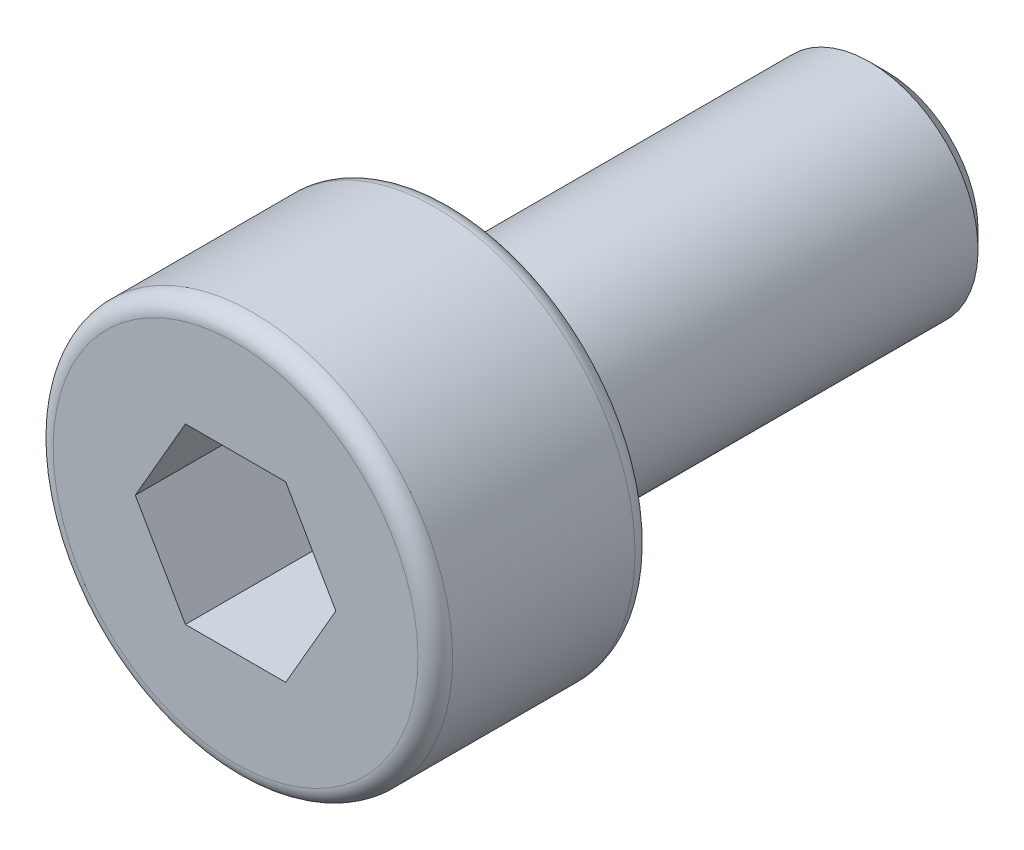
ISO-10303-21;
HEADER;
FILE_DESCRIPTION(('STEP AP214'),'2;1');
FILE_NAME('part.step','',(''),(''),'','','');
FILE_SCHEMA(('AUTOMOTIVE_DESIGN { 1 0 10303 214 1 1 1 1 }'));
ENDSEC;
DATA;
#1=APPLICATION_CONTEXT('core data for automotive mechanical design processes');
#2=APPLICATION_PROTOCOL_DEFINITION('international standard','automotive_design',2000,#1);
#3=PRODUCT_CONTEXT('',#1,'mechanical');
#4=PRODUCT('Part','Part','',(#3));
#5=PRODUCT_RELATED_PRODUCT_CATEGORY('part','',(#4));
#6=PRODUCT_DEFINITION_FORMATION('','',#4);
#7=PRODUCT_DEFINITION_CONTEXT('part definition',#1,'design');
#8=PRODUCT_DEFINITION('design','',#6,#7);
#9=PRODUCT_DEFINITION_SHAPE('','',#8);
#10=(LENGTH_UNIT() NAMED_UNIT(*) SI_UNIT(.MILLI.,.METRE.));
#11=(NAMED_UNIT(*) PLANE_ANGLE_UNIT() SI_UNIT($,.RADIAN.));
#12=(NAMED_UNIT(*) SI_UNIT($,.STERADIAN.) SOLID_ANGLE_UNIT());
#13=UNCERTAINTY_MEASURE_WITH_UNIT(LENGTH_MEASURE(1.E-05),#10,'distance_accuracy_value','');
#14=(GEOMETRIC_REPRESENTATION_CONTEXT(3) GLOBAL_UNCERTAINTY_ASSIGNED_CONTEXT((#13)) GLOBAL_UNIT_ASSIGNED_CONTEXT((#10,
#11,#12)) REPRESENTATION_CONTEXT('',''));
#15=CARTESIAN_POINT('',(0.,0.,0.));
#16=DIRECTION('',(0.,0.,1.));
#17=DIRECTION('',(1.,0.,0.));
#18=AXIS2_PLACEMENT_3D('',#15,#16,#17);
#19=CARTESIAN_POINT('',(0.,0.,0.));
#20=DIRECTION('',(0.,0.,1.));
#21=DIRECTION('',(0.,-1.,0.));
#22=AXIS2_PLACEMENT_3D('',#19,#20,#21);
#23=PLANE('',#22);
#24=DIRECTION('',(0.5,0.866025403784439,0.));
#25=VECTOR('',#24,1.);
#26=CARTESIAN_POINT('',(0.577350269189626,-1.,0.));
#27=LINE('',#26,#25);
#28=CARTESIAN_POINT('',(0.577350269189626,-1.,0.));
#29=VERTEX_POINT('',#28);
#30=CARTESIAN_POINT('',(1.15470053837925,0.,0.));
#31=VERTEX_POINT('',#30);
#32=EDGE_CURVE('E51',#29,#31,#27,.T.);
#33=ORIENTED_EDGE('',*,*,#32,.F.);
#34=DIRECTION('',(1.,0.,0.));
#35=VECTOR('',#34,1.);
#36=CARTESIAN_POINT('',(-0.577350269189626,-1.,0.));
#37=LINE('',#36,#35);
#38=CARTESIAN_POINT('',(-0.577350269189626,-1.,0.));
#39=VERTEX_POINT('',#38);
#40=EDGE_CURVE('E134',#39,#29,#37,.T.);
#41=ORIENTED_EDGE('',*,*,#40,.F.);
#42=DIRECTION('',(0.5,-0.866025403784438,0.));
#43=VECTOR('',#42,1.);
#44=CARTESIAN_POINT('',(-1.15470053837925,0.,0.));
#45=LINE('',#44,#43);
#46=CARTESIAN_POINT('',(-1.15470053837925,0.,0.));
#47=VERTEX_POINT('',#46);
#48=EDGE_CURVE('E132',#47,#39,#45,.T.);
#49=ORIENTED_EDGE('',*,*,#48,.F.);
#50=DIRECTION('',(-0.5,-0.866025403784439,0.));
#51=VECTOR('',#50,1.);
#52=CARTESIAN_POINT('',(-0.577350269189626,1.,0.));
#53=LINE('',#52,#51);
#54=CARTESIAN_POINT('',(-0.577350269189626,1.,0.));
#55=VERTEX_POINT('',#54);
#56=EDGE_CURVE('E99',#55,#47,#53,.T.);
#57=ORIENTED_EDGE('',*,*,#56,.F.);
#58=DIRECTION('',(-1.,0.,0.));
#59=VECTOR('',#58,1.);
#60=CARTESIAN_POINT('',(0.577350269189625,1.,0.));
#61=LINE('',#60,#59);
#62=CARTESIAN_POINT('',(0.577350269189625,1.,0.));
#63=VERTEX_POINT('',#62);
#64=EDGE_CURVE('E128',#63,#55,#61,.T.);
#65=ORIENTED_EDGE('',*,*,#64,.F.);
#66=DIRECTION('',(-0.5,0.866025403784438,0.));
#67=VECTOR('',#66,1.);
#68=CARTESIAN_POINT('',(1.15470053837925,0.,0.));
#69=LINE('',#68,#67);
#70=EDGE_CURVE('E125',#31,#63,#69,.T.);
#71=ORIENTED_EDGE('',*,*,#70,.F.);
#72=EDGE_LOOP('',(#33,#41,#49,#57,#65,#71));
#73=FACE_BOUND('',#72,.T.);
#74=CARTESIAN_POINT('',(0.,0.,0.));
#75=DIRECTION('',(0.,0.,1.));
#76=DIRECTION('',(0.,-1.,0.));
#77=AXIS2_PLACEMENT_3D('',#74,#75,#76);
#78=CIRCLE('',#77,2.1);
#79=CARTESIAN_POINT('',(0.,-2.1,0.));
#80=VERTEX_POINT('',#79);
#81=EDGE_CURVE('E155',#80,#80,#78,.T.);
#82=ORIENTED_EDGE('',*,*,#81,.T.);
#83=EDGE_LOOP('',(#82));
#84=FACE_BOUND('',#83,.T.);
#85=ADVANCED_FACE('F35',(#73,#84),#23,.T.);
#86=CARTESIAN_POINT('',(0.,0.,-7.5));
#87=DIRECTION('',(0.,0.,-1.));
#88=DIRECTION('',(0.,1.,0.));
#89=AXIS2_PLACEMENT_3D('',#86,#87,#88);
#90=CYLINDRICAL_SURFACE('',#89,2.3);
#91=CARTESIAN_POINT('',(0.,0.,-2.3));
#92=DIRECTION('',(0.,0.,-1.));
#93=DIRECTION('',(0.,1.,0.));
#94=AXIS2_PLACEMENT_3D('',#91,#92,#93);
#95=CIRCLE('',#94,2.3);
#96=CARTESIAN_POINT('',(0.,2.3,-2.3));
#97=VERTEX_POINT('',#96);
#98=EDGE_CURVE('E152',#97,#97,#95,.F.);
#99=ORIENTED_EDGE('',*,*,#98,.T.);
#100=EDGE_LOOP('',(#99));
#101=FACE_BOUND('',#100,.T.);
#102=CARTESIAN_POINT('',(0.,0.,-0.2));
#103=DIRECTION('',(0.,0.,1.));
#104=DIRECTION('',(0.,-1.,0.));
#105=AXIS2_PLACEMENT_3D('',#102,#103,#104);
#106=CIRCLE('',#105,2.3);
#107=CARTESIAN_POINT('',(0.,-2.3,-0.2));
#108=VERTEX_POINT('',#107);
#109=EDGE_CURVE('E149',#108,#108,#106,.F.);
#110=ORIENTED_EDGE('',*,*,#109,.T.);
#111=EDGE_LOOP('',(#110));
#112=FACE_BOUND('',#111,.T.);
#113=ADVANCED_FACE('F176',(#101,#112),#90,.T.);
#114=CARTESIAN_POINT('',(0.,2.3,-2.5));
#115=DIRECTION('',(0.,0.,-1.));
#116=DIRECTION('',(0.,1.,0.));
#117=AXIS2_PLACEMENT_3D('',#114,#115,#116);
#118=PLANE('',#117);
#119=CARTESIAN_POINT('',(0.,0.,-2.5));
#120=DIRECTION('',(0.,0.,-1.));
#121=DIRECTION('',(0.,1.,0.));
#122=AXIS2_PLACEMENT_3D('',#119,#120,#121);
#123=CIRCLE('',#122,2.1);
#124=CARTESIAN_POINT('',(0.,2.1,-2.5));
#125=VERTEX_POINT('',#124);
#126=EDGE_CURVE('E146',#125,#125,#123,.T.);
#127=ORIENTED_EDGE('',*,*,#126,.T.);
#128=EDGE_LOOP('',(#127));
#129=FACE_BOUND('',#128,.T.);
#130=CARTESIAN_POINT('',(0.,0.,-2.5));
#131=DIRECTION('',(0.,0.,-1.));
#132=DIRECTION('',(0.,1.,0.));
#133=AXIS2_PLACEMENT_3D('',#130,#131,#132);
#134=CIRCLE('',#133,1.25);
#135=CARTESIAN_POINT('',(0.,1.25,-2.5));
#136=VERTEX_POINT('',#135);
#137=EDGE_CURVE('E138',#136,#136,#134,.T.);
#138=ORIENTED_EDGE('',*,*,#137,.F.);
#139=EDGE_LOOP('',(#138));
#140=FACE_BOUND('',#139,.T.);
#141=ADVANCED_FACE('F182',(#129,#140),#118,.T.);
#142=CARTESIAN_POINT('',(0.,0.,-7.5));
#143=DIRECTION('',(0.,0.,-1.));
#144=DIRECTION('',(0.,1.,0.));
#145=AXIS2_PLACEMENT_3D('',#142,#143,#144);
#146=CYLINDRICAL_SURFACE('',#145,1.25);
#147=CARTESIAN_POINT('',(0.,0.,-7.3));
#148=DIRECTION('',(0.,0.,-1.));
#149=DIRECTION('',(0.,1.,0.));
#150=AXIS2_PLACEMENT_3D('',#147,#148,#149);
#151=CIRCLE('',#150,1.25);
#152=CARTESIAN_POINT('',(0.,1.25,-7.3));
#153=VERTEX_POINT('',#152);
#154=EDGE_CURVE('E11',#153,#153,#151,.F.);
#155=ORIENTED_EDGE('',*,*,#154,.T.);
#156=EDGE_LOOP('',(#155));
#157=FACE_BOUND('',#156,.T.);
#158=ORIENTED_EDGE('',*,*,#137,.T.);
#159=EDGE_LOOP('',(#158));
#160=FACE_BOUND('',#159,.T.);
#161=ADVANCED_FACE('F193',(#157,#160),#146,.T.);
#162=CARTESIAN_POINT('',(0.,1.25,-7.5));
#163=DIRECTION('',(0.,0.,-1.));
#164=DIRECTION('',(0.,1.,0.));
#165=AXIS2_PLACEMENT_3D('',#162,#163,#164);
#166=PLANE('',#165);
#167=CARTESIAN_POINT('',(0.,0.,-7.5));
#168=DIRECTION('',(0.,0.,-1.));
#169=DIRECTION('',(0.,1.,0.));
#170=AXIS2_PLACEMENT_3D('',#167,#168,#169);
#171=CIRCLE('',#170,1.05);
#172=CARTESIAN_POINT('',(0.,1.05,-7.5));
#173=VERTEX_POINT('',#172);
#174=EDGE_CURVE('E44',#173,#173,#171,.T.);
#175=ORIENTED_EDGE('',*,*,#174,.T.);
#176=EDGE_LOOP('',(#175));
#177=FACE_BOUND('',#176,.T.);
#178=ADVANCED_FACE('F160',(#177),#166,.T.);
#179=CARTESIAN_POINT('',(0.,0.,-2.3));
#180=DIRECTION('',(0.,0.,-1.));
#181=DIRECTION('',(0.,1.,0.));
#182=AXIS2_PLACEMENT_3D('',#179,#180,#181);
#183=TOROIDAL_SURFACE('',#182,2.1,0.2);
#184=ORIENTED_EDGE('',*,*,#98,.F.);
#185=EDGE_LOOP('',(#184));
#186=FACE_BOUND('',#185,.T.);
#187=ORIENTED_EDGE('',*,*,#126,.F.);
#188=EDGE_LOOP('',(#187));
#189=FACE_BOUND('',#188,.T.);
#190=ADVANCED_FACE('F172',(#186,#189),#183,.T.);
#191=CARTESIAN_POINT('',(0.,0.,-0.2));
#192=DIRECTION('',(0.,0.,1.));
#193=DIRECTION('',(0.,-1.,0.));
#194=AXIS2_PLACEMENT_3D('',#191,#192,#193);
#195=TOROIDAL_SURFACE('',#194,2.1,0.2);
#196=ORIENTED_EDGE('',*,*,#81,.F.);
#197=EDGE_LOOP('',(#196));
#198=FACE_BOUND('',#197,.T.);
#199=ORIENTED_EDGE('',*,*,#109,.F.);
#200=EDGE_LOOP('',(#199));
#201=FACE_BOUND('',#200,.T.);
#202=ADVANCED_FACE('F164',(#198,#201),#195,.T.);
#203=CARTESIAN_POINT('',(0.,0.,-7.5));
#204=DIRECTION('',(0.,0.,1.));
#205=DIRECTION('',(0.,-1.,0.));
#206=AXIS2_PLACEMENT_3D('',#203,#204,#205);
#207=CONICAL_SURFACE('',#206,1.05,0.785398163397441);
#208=ORIENTED_EDGE('',*,*,#154,.F.);
#209=EDGE_LOOP('',(#208));
#210=FACE_BOUND('',#209,.T.);
#211=ORIENTED_EDGE('',*,*,#174,.F.);
#212=EDGE_LOOP('',(#211));
#213=FACE_BOUND('',#212,.T.);
#214=ADVANCED_FACE('F38',(#210,#213),#207,.T.);
#215=CARTESIAN_POINT('',(0.577350269189626,-1.,-1.5));
#216=DIRECTION('',(0.866025403784439,-0.5,0.));
#217=DIRECTION('',(0.5,0.866025403784439,0.));
#218=AXIS2_PLACEMENT_3D('',#215,#216,#217);
#219=PLANE('',#218);
#220=ORIENTED_EDGE('',*,*,#32,.T.);
#221=DIRECTION('',(0.,0.,1.));
#222=VECTOR('',#221,1.);
#223=CARTESIAN_POINT('',(1.15470053837925,0.,-1.5));
#224=LINE('',#223,#222);
#225=CARTESIAN_POINT('',(1.15470053837925,0.,-1.5));
#226=VERTEX_POINT('',#225);
#227=EDGE_CURVE('E81',#226,#31,#224,.T.);
#228=ORIENTED_EDGE('',*,*,#227,.F.);
#229=DIRECTION('',(0.5,0.866025403784439,0.));
#230=VECTOR('',#229,1.);
#231=CARTESIAN_POINT('',(0.577350269189626,-1.,-1.5));
#232=LINE('',#231,#230);
#233=CARTESIAN_POINT('',(0.577350269189626,-1.,-1.5));
#234=VERTEX_POINT('',#233);
#235=EDGE_CURVE('E136',#234,#226,#232,.T.);
#236=ORIENTED_EDGE('',*,*,#235,.F.);
#237=DIRECTION('',(0.,0.,1.));
#238=VECTOR('',#237,1.);
#239=CARTESIAN_POINT('',(0.577350269189626,-1.,-1.5));
#240=LINE('',#239,#238);
#241=EDGE_CURVE('E59',#234,#29,#240,.T.);
#242=ORIENTED_EDGE('',*,*,#241,.T.);
#243=EDGE_LOOP('',(#220,#228,#236,#242));
#244=FACE_BOUND('',#243,.T.);
#245=ADVANCED_FACE('F163',(#244),#219,.F.);
#246=CARTESIAN_POINT('',(-0.577350269189626,-1.,-1.5));
#247=DIRECTION('',(0.,-1.,0.));
#248=DIRECTION('',(0.,0.,-1.));
#249=AXIS2_PLACEMENT_3D('',#246,#247,#248);
#250=PLANE('',#249);
#251=ORIENTED_EDGE('',*,*,#40,.T.);
#252=ORIENTED_EDGE('',*,*,#241,.F.);
#253=DIRECTION('',(1.,0.,0.));
#254=VECTOR('',#253,1.);
#255=CARTESIAN_POINT('',(-0.577350269189626,-1.,-1.5));
#256=LINE('',#255,#254);
#257=CARTESIAN_POINT('',(-0.577350269189626,-1.,-1.5));
#258=VERTEX_POINT('',#257);
#259=EDGE_CURVE('E111',#258,#234,#256,.T.);
#260=ORIENTED_EDGE('',*,*,#259,.F.);
#261=DIRECTION('',(0.,0.,1.));
#262=VECTOR('',#261,1.);
#263=CARTESIAN_POINT('',(-0.577350269189626,-1.,-1.5));
#264=LINE('',#263,#262);
#265=EDGE_CURVE('E103',#258,#39,#264,.T.);
#266=ORIENTED_EDGE('',*,*,#265,.T.);
#267=EDGE_LOOP('',(#251,#252,#260,#266));
#268=FACE_BOUND('',#267,.T.);
#269=ADVANCED_FACE('F170',(#268),#250,.F.);
#270=CARTESIAN_POINT('',(-1.15470053837925,0.,-1.5));
#271=DIRECTION('',(-0.866025403784438,-0.5,0.));
#272=DIRECTION('',(0.5,-0.866025403784438,0.));
#273=AXIS2_PLACEMENT_3D('',#270,#271,#272);
#274=PLANE('',#273);
#275=ORIENTED_EDGE('',*,*,#48,.T.);
#276=ORIENTED_EDGE('',*,*,#265,.F.);
#277=DIRECTION('',(0.5,-0.866025403784438,0.));
#278=VECTOR('',#277,1.);
#279=CARTESIAN_POINT('',(-1.15470053837925,0.,-1.5));
#280=LINE('',#279,#278);
#281=CARTESIAN_POINT('',(-1.15470053837925,0.,-1.5));
#282=VERTEX_POINT('',#281);
#283=EDGE_CURVE('E107',#282,#258,#280,.T.);
#284=ORIENTED_EDGE('',*,*,#283,.F.);
#285=DIRECTION('',(0.,0.,1.));
#286=VECTOR('',#285,1.);
#287=CARTESIAN_POINT('',(-1.15470053837925,0.,-1.5));
#288=LINE('',#287,#286);
#289=EDGE_CURVE('E92',#282,#47,#288,.T.);
#290=ORIENTED_EDGE('',*,*,#289,.T.);
#291=EDGE_LOOP('',(#275,#276,#284,#290));
#292=FACE_BOUND('',#291,.T.);
#293=ADVANCED_FACE('F108',(#292),#274,.F.);
#294=CARTESIAN_POINT('',(-0.577350269189626,1.,-1.5));
#295=DIRECTION('',(-0.866025403784439,0.5,0.));
#296=DIRECTION('',(-0.5,-0.866025403784439,0.));
#297=AXIS2_PLACEMENT_3D('',#294,#295,#296);
#298=PLANE('',#297);
#299=ORIENTED_EDGE('',*,*,#56,.T.);
#300=ORIENTED_EDGE('',*,*,#289,.F.);
#301=DIRECTION('',(-0.5,-0.866025403784439,0.));
#302=VECTOR('',#301,1.);
#303=CARTESIAN_POINT('',(-0.577350269189626,1.,-1.5));
#304=LINE('',#303,#302);
#305=CARTESIAN_POINT('',(-0.577350269189626,1.,-1.5));
#306=VERTEX_POINT('',#305);
#307=EDGE_CURVE('E96',#306,#282,#304,.T.);
#308=ORIENTED_EDGE('',*,*,#307,.F.);
#309=DIRECTION('',(0.,0.,1.));
#310=VECTOR('',#309,1.);
#311=CARTESIAN_POINT('',(-0.577350269189626,1.,-1.5));
#312=LINE('',#311,#310);
#313=EDGE_CURVE('E104',#306,#55,#312,.T.);
#314=ORIENTED_EDGE('',*,*,#313,.T.);
#315=EDGE_LOOP('',(#299,#300,#308,#314));
#316=FACE_BOUND('',#315,.T.);
#317=ADVANCED_FACE('F94',(#316),#298,.F.);
#318=CARTESIAN_POINT('',(0.577350269189625,1.,-1.5));
#319=DIRECTION('',(0.,1.,0.));
#320=DIRECTION('',(0.,0.,1.));
#321=AXIS2_PLACEMENT_3D('',#318,#319,#320);
#322=PLANE('',#321);
#323=ORIENTED_EDGE('',*,*,#64,.T.);
#324=ORIENTED_EDGE('',*,*,#313,.F.);
#325=DIRECTION('',(-1.,0.,0.));
#326=VECTOR('',#325,1.);
#327=CARTESIAN_POINT('',(0.577350269189625,1.,-1.5));
#328=LINE('',#327,#326);
#329=CARTESIAN_POINT('',(0.577350269189625,1.,-1.5));
#330=VERTEX_POINT('',#329);
#331=EDGE_CURVE('E117',#330,#306,#328,.T.);
#332=ORIENTED_EDGE('',*,*,#331,.F.);
#333=DIRECTION('',(0.,0.,1.));
#334=VECTOR('',#333,1.);
#335=CARTESIAN_POINT('',(0.577350269189625,1.,-1.5));
#336=LINE('',#335,#334);
#337=EDGE_CURVE('E141',#330,#63,#336,.T.);
#338=ORIENTED_EDGE('',*,*,#337,.T.);
#339=EDGE_LOOP('',(#323,#324,#332,#338));
#340=FACE_BOUND('',#339,.T.);
#341=ADVANCED_FACE('F212',(#340),#322,.F.);
#342=CARTESIAN_POINT('',(1.15470053837925,0.,-1.5));
#343=DIRECTION('',(0.866025403784439,0.5,0.));
#344=DIRECTION('',(-0.5,0.866025403784439,0.));
#345=AXIS2_PLACEMENT_3D('',#342,#343,#344);
#346=PLANE('',#345);
#347=ORIENTED_EDGE('',*,*,#70,.T.);
#348=ORIENTED_EDGE('',*,*,#337,.F.);
#349=DIRECTION('',(-0.5,0.866025403784438,0.));
#350=VECTOR('',#349,1.);
#351=CARTESIAN_POINT('',(1.15470053837925,0.,-1.5));
#352=LINE('',#351,#350);
#353=EDGE_CURVE('E119',#226,#330,#352,.T.);
#354=ORIENTED_EDGE('',*,*,#353,.F.);
#355=ORIENTED_EDGE('',*,*,#227,.T.);
#356=EDGE_LOOP('',(#347,#348,#354,#355));
#357=FACE_BOUND('',#356,.T.);
#358=ADVANCED_FACE('F209',(#357),#346,.F.);
#359=CARTESIAN_POINT('',(0.,0.,-1.5));
#360=DIRECTION('',(0.,0.,1.));
#361=DIRECTION('',(1.,0.,0.));
#362=AXIS2_PLACEMENT_3D('',#359,#360,#361);
#363=PLANE('',#362);
#364=ORIENTED_EDGE('',*,*,#235,.T.);
#365=ORIENTED_EDGE('',*,*,#353,.T.);
#366=ORIENTED_EDGE('',*,*,#331,.T.);
#367=ORIENTED_EDGE('',*,*,#307,.T.);
#368=ORIENTED_EDGE('',*,*,#283,.T.);
#369=ORIENTED_EDGE('',*,*,#259,.T.);
#370=EDGE_LOOP('',(#364,#365,#366,#367,#368,#369));
#371=FACE_BOUND('',#370,.T.);
#372=ADVANCED_FACE('F114',(#371),#363,.T.);
#373=CLOSED_SHELL('',(#85,#113,#141,#161,#178,#190,#202,#214,#245,#269,#293,#317,#341,#358,#372));
#374=MANIFOLD_SOLID_BREP('B2',#373);
#375=ADVANCED_BREP_SHAPE_REPRESENTATION('',(#18,#374),#14);
#376=SHAPE_DEFINITION_REPRESENTATION(#9,#375);
ENDSEC;
END-ISO-10303-21;
